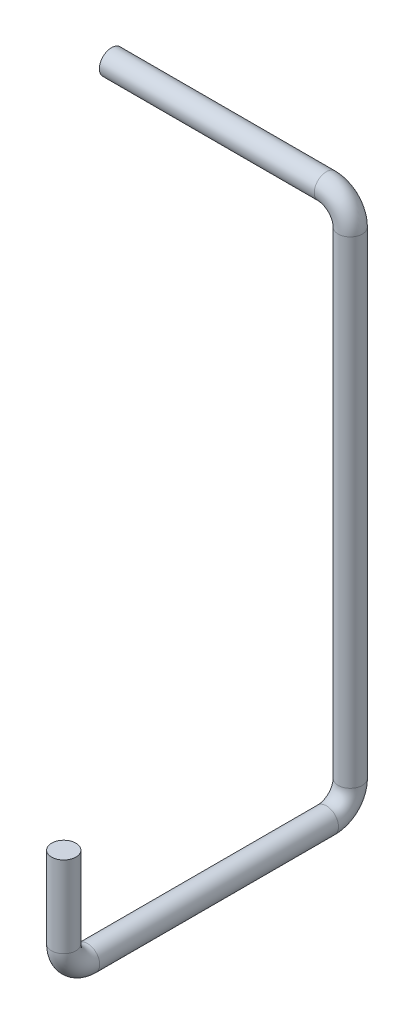
ISO-10303-21;
HEADER;
FILE_DESCRIPTION(('STEP AP214'),'2;1');
FILE_NAME('part.step','',(''),(''),'','','');
FILE_SCHEMA(('AUTOMOTIVE_DESIGN { 1 0 10303 214 1 1 1 1 }'));
ENDSEC;
DATA;
#1=APPLICATION_CONTEXT('core data for automotive mechanical design processes');
#2=APPLICATION_PROTOCOL_DEFINITION('international standard','automotive_design',2000,#1);
#3=PRODUCT_CONTEXT('',#1,'mechanical');
#4=PRODUCT('Part','Part','',(#3));
#5=PRODUCT_RELATED_PRODUCT_CATEGORY('part','',(#4));
#6=PRODUCT_DEFINITION_FORMATION('','',#4);
#7=PRODUCT_DEFINITION_CONTEXT('part definition',#1,'design');
#8=PRODUCT_DEFINITION('design','',#6,#7);
#9=PRODUCT_DEFINITION_SHAPE('','',#8);
#10=(LENGTH_UNIT() NAMED_UNIT(*) SI_UNIT(.MILLI.,.METRE.));
#11=(NAMED_UNIT(*) PLANE_ANGLE_UNIT() SI_UNIT($,.RADIAN.));
#12=(NAMED_UNIT(*) SI_UNIT($,.STERADIAN.) SOLID_ANGLE_UNIT());
#13=UNCERTAINTY_MEASURE_WITH_UNIT(LENGTH_MEASURE(1.E-05),#10,'distance_accuracy_value','');
#14=(GEOMETRIC_REPRESENTATION_CONTEXT(3) GLOBAL_UNCERTAINTY_ASSIGNED_CONTEXT((#13)) GLOBAL_UNIT_ASSIGNED_CONTEXT((#10,
#11,#12)) REPRESENTATION_CONTEXT('',''));
#15=CARTESIAN_POINT('',(0.,0.,0.));
#16=DIRECTION('',(0.,0.,1.));
#17=DIRECTION('',(1.,0.,0.));
#18=AXIS2_PLACEMENT_3D('',#15,#16,#17);
#19=CARTESIAN_POINT('',(0.,-10.,0.));
#20=DIRECTION('',(0.,1.,0.));
#21=DIRECTION('',(0.,0.,1.));
#22=AXIS2_PLACEMENT_3D('',#19,#20,#21);
#23=CYLINDRICAL_SURFACE('',#22,12.7);
#24=CARTESIAN_POINT('',(0.,0.,0.));
#25=DIRECTION('',(0.,1.,0.));
#26=DIRECTION('',(0.,0.,1.));
#27=AXIS2_PLACEMENT_3D('',#24,#25,#26);
#28=CIRCLE('',#27,12.7);
#29=CARTESIAN_POINT('',(0.,0.,12.7));
#30=VERTEX_POINT('',#29);
#31=EDGE_CURVE('E11',#30,#30,#28,.T.);
#32=ORIENTED_EDGE('',*,*,#31,.F.);
#33=EDGE_LOOP('',(#32));
#34=FACE_BOUND('',#33,.T.);
#35=CARTESIAN_POINT('',(0.,-85.,0.));
#36=DIRECTION('',(0.,-1.,0.));
#37=DIRECTION('',(0.,0.,-1.));
#38=AXIS2_PLACEMENT_3D('',#35,#36,#37);
#39=CIRCLE('',#38,12.7);
#40=CARTESIAN_POINT('',(0.,-85.,12.7));
#41=VERTEX_POINT('',#40);
#42=EDGE_CURVE('E63',#41,#41,#39,.T.);
#43=ORIENTED_EDGE('',*,*,#42,.F.);
#44=EDGE_LOOP('',(#43));
#45=FACE_BOUND('',#44,.T.);
#46=ADVANCED_FACE('F35',(#34,#45),#23,.T.);
#47=CARTESIAN_POINT('',(0.,0.,0.));
#48=DIRECTION('',(0.,1.,0.));
#49=DIRECTION('',(0.,0.,1.));
#50=AXIS2_PLACEMENT_3D('',#47,#48,#49);
#51=PLANE('',#50);
#52=ORIENTED_EDGE('',*,*,#31,.T.);
#53=EDGE_LOOP('',(#52));
#54=FACE_BOUND('',#53,.T.);
#55=ADVANCED_FACE('F70',(#54),#51,.T.);
#56=CARTESIAN_POINT('',(-250.,440.,-300.));
#57=DIRECTION('',(-1.,0.,0.));
#58=DIRECTION('',(0.,0.,1.));
#59=AXIS2_PLACEMENT_3D('',#56,#57,#58);
#60=PLANE('',#59);
#61=CARTESIAN_POINT('',(-250.,440.,-300.));
#62=DIRECTION('',(-1.,0.,0.));
#63=DIRECTION('',(0.,0.,1.));
#64=AXIS2_PLACEMENT_3D('',#61,#62,#63);
#65=CIRCLE('',#64,12.7);
#66=CARTESIAN_POINT('',(-250.,440.,-287.3));
#67=VERTEX_POINT('',#66);
#68=EDGE_CURVE('E41',#67,#67,#65,.T.);
#69=ORIENTED_EDGE('',*,*,#68,.T.);
#70=EDGE_LOOP('',(#69));
#71=FACE_BOUND('',#70,.T.);
#72=ADVANCED_FACE('F45',(#71),#60,.T.);
#73=CARTESIAN_POINT('',(0.,-85.,-25.));
#74=DIRECTION('',(1.,0.,0.));
#75=DIRECTION('',(0.,0.,-1.));
#76=AXIS2_PLACEMENT_3D('',#73,#74,#75);
#77=TOROIDAL_SURFACE('',#76,25.,12.7);
#78=CARTESIAN_POINT('',(0.,-110.,-25.));
#79=DIRECTION('',(0.,0.,-1.));
#80=DIRECTION('',(0.,1.,0.));
#81=AXIS2_PLACEMENT_3D('',#78,#79,#80);
#82=CIRCLE('',#81,12.7);
#83=CARTESIAN_POINT('',(0.,-122.7,-25.));
#84=VERTEX_POINT('',#83);
#85=EDGE_CURVE('E60',#84,#84,#82,.T.);
#86=CARTESIAN_POINT('',(0.,-85.,-25.));
#87=DIRECTION('',(1.,0.,0.));
#88=DIRECTION('',(0.,0.,-1.));
#89=AXIS2_PLACEMENT_3D('',#86,#87,#88);
#90=CIRCLE('',#89,37.7);
#91=EDGE_CURVE('',#41,#84,#90,.T.);
#92=ORIENTED_EDGE('',*,*,#42,.T.);
#93=ORIENTED_EDGE('',*,*,#85,.F.);
#94=ORIENTED_EDGE('',*,*,#91,.T.);
#95=ORIENTED_EDGE('',*,*,#91,.F.);
#96=EDGE_LOOP('',(#92,#94,#93,#95));
#97=FACE_BOUND('',#96,.T.);
#98=ADVANCED_FACE('F67',(#97),#77,.T.);
#99=CARTESIAN_POINT('',(0.,-110.,-25.));
#100=DIRECTION('',(0.,0.,-1.));
#101=DIRECTION('',(-1.,0.,0.));
#102=AXIS2_PLACEMENT_3D('',#99,#100,#101);
#103=CYLINDRICAL_SURFACE('',#102,12.7);
#104=CARTESIAN_POINT('',(0.,-110.,-275.));
#105=DIRECTION('',(0.,0.,-1.));
#106=DIRECTION('',(0.,1.,0.));
#107=AXIS2_PLACEMENT_3D('',#104,#105,#106);
#108=CIRCLE('',#107,12.7);
#109=CARTESIAN_POINT('',(0.,-122.7,-275.));
#110=VERTEX_POINT('',#109);
#111=EDGE_CURVE('E57',#110,#110,#108,.T.);
#112=ORIENTED_EDGE('',*,*,#111,.F.);
#113=EDGE_LOOP('',(#112));
#114=FACE_BOUND('',#113,.T.);
#115=ORIENTED_EDGE('',*,*,#85,.T.);
#116=EDGE_LOOP('',(#115));
#117=FACE_BOUND('',#116,.T.);
#118=ADVANCED_FACE('F99',(#114,#117),#103,.T.);
#119=CARTESIAN_POINT('',(0.,-85.,-275.));
#120=DIRECTION('',(1.,0.,0.));
#121=DIRECTION('',(0.,0.,-1.));
#122=AXIS2_PLACEMENT_3D('',#119,#120,#121);
#123=TOROIDAL_SURFACE('',#122,25.,12.7);
#124=CARTESIAN_POINT('',(0.,-85.,-300.));
#125=DIRECTION('',(0.,1.,0.));
#126=DIRECTION('',(0.,0.,1.));
#127=AXIS2_PLACEMENT_3D('',#124,#125,#126);
#128=CIRCLE('',#127,12.7);
#129=CARTESIAN_POINT('',(0.,-85.,-312.7));
#130=VERTEX_POINT('',#129);
#131=EDGE_CURVE('E54',#130,#130,#128,.T.);
#132=CARTESIAN_POINT('',(0.,-85.,-275.));
#133=DIRECTION('',(1.,0.,0.));
#134=DIRECTION('',(0.,0.,-1.));
#135=AXIS2_PLACEMENT_3D('',#132,#133,#134);
#136=CIRCLE('',#135,37.7);
#137=EDGE_CURVE('',#110,#130,#136,.T.);
#138=ORIENTED_EDGE('',*,*,#111,.T.);
#139=ORIENTED_EDGE('',*,*,#131,.F.);
#140=ORIENTED_EDGE('',*,*,#137,.T.);
#141=ORIENTED_EDGE('',*,*,#137,.F.);
#142=EDGE_LOOP('',(#138,#140,#139,#141));
#143=FACE_BOUND('',#142,.T.);
#144=ADVANCED_FACE('F95',(#143),#123,.T.);
#145=CARTESIAN_POINT('',(0.,-85.,-300.));
#146=DIRECTION('',(0.,1.,0.));
#147=DIRECTION('',(0.,0.,1.));
#148=AXIS2_PLACEMENT_3D('',#145,#146,#147);
#149=CYLINDRICAL_SURFACE('',#148,12.7);
#150=CARTESIAN_POINT('',(0.,415.,-300.));
#151=DIRECTION('',(0.,1.,0.));
#152=DIRECTION('',(0.,0.,1.));
#153=AXIS2_PLACEMENT_3D('',#150,#151,#152);
#154=CIRCLE('',#153,12.7);
#155=CARTESIAN_POINT('',(12.7,415.,-300.));
#156=VERTEX_POINT('',#155);
#157=EDGE_CURVE('E49',#156,#156,#154,.T.);
#158=ORIENTED_EDGE('',*,*,#157,.F.);
#159=EDGE_LOOP('',(#158));
#160=FACE_BOUND('',#159,.T.);
#161=ORIENTED_EDGE('',*,*,#131,.T.);
#162=EDGE_LOOP('',(#161));
#163=FACE_BOUND('',#162,.T.);
#164=ADVANCED_FACE('F88',(#160,#163),#149,.T.);
#165=CARTESIAN_POINT('',(-25.,415.,-300.));
#166=DIRECTION('',(0.,0.,1.));
#167=DIRECTION('',(1.,0.,0.));
#168=AXIS2_PLACEMENT_3D('',#165,#166,#167);
#169=TOROIDAL_SURFACE('',#168,25.,12.7);
#170=CARTESIAN_POINT('',(-25.,440.,-300.));
#171=DIRECTION('',(-1.,0.,0.));
#172=DIRECTION('',(0.,0.,1.));
#173=AXIS2_PLACEMENT_3D('',#170,#171,#172);
#174=CIRCLE('',#173,12.7);
#175=CARTESIAN_POINT('',(-25.,452.7,-300.));
#176=VERTEX_POINT('',#175);
#177=EDGE_CURVE('E47',#176,#176,#174,.T.);
#178=CARTESIAN_POINT('',(-25.,415.,-300.));
#179=DIRECTION('',(0.,0.,1.));
#180=DIRECTION('',(1.,0.,0.));
#181=AXIS2_PLACEMENT_3D('',#178,#179,#180);
#182=CIRCLE('',#181,37.7);
#183=EDGE_CURVE('',#156,#176,#182,.T.);
#184=ORIENTED_EDGE('',*,*,#157,.T.);
#185=ORIENTED_EDGE('',*,*,#177,.F.);
#186=ORIENTED_EDGE('',*,*,#183,.T.);
#187=ORIENTED_EDGE('',*,*,#183,.F.);
#188=EDGE_LOOP('',(#184,#186,#185,#187));
#189=FACE_BOUND('',#188,.T.);
#190=ADVANCED_FACE('F83',(#189),#169,.T.);
#191=CARTESIAN_POINT('',(-25.,440.,-300.));
#192=DIRECTION('',(-1.,0.,0.));
#193=DIRECTION('',(0.,-1.,0.));
#194=AXIS2_PLACEMENT_3D('',#191,#192,#193);
#195=CYLINDRICAL_SURFACE('',#194,12.7);
#196=ORIENTED_EDGE('',*,*,#68,.F.);
#197=EDGE_LOOP('',(#196));
#198=FACE_BOUND('',#197,.T.);
#199=ORIENTED_EDGE('',*,*,#177,.T.);
#200=EDGE_LOOP('',(#199));
#201=FACE_BOUND('',#200,.T.);
#202=ADVANCED_FACE('F76',(#198,#201),#195,.T.);
#203=CLOSED_SHELL('',(#46,#55,#72,#98,#118,#144,#164,#190,#202));
#204=MANIFOLD_SOLID_BREP('B2',#203);
#205=ADVANCED_BREP_SHAPE_REPRESENTATION('',(#18,#204),#14);
#206=SHAPE_DEFINITION_REPRESENTATION(#9,#205);
ENDSEC;
END-ISO-10303-21;
